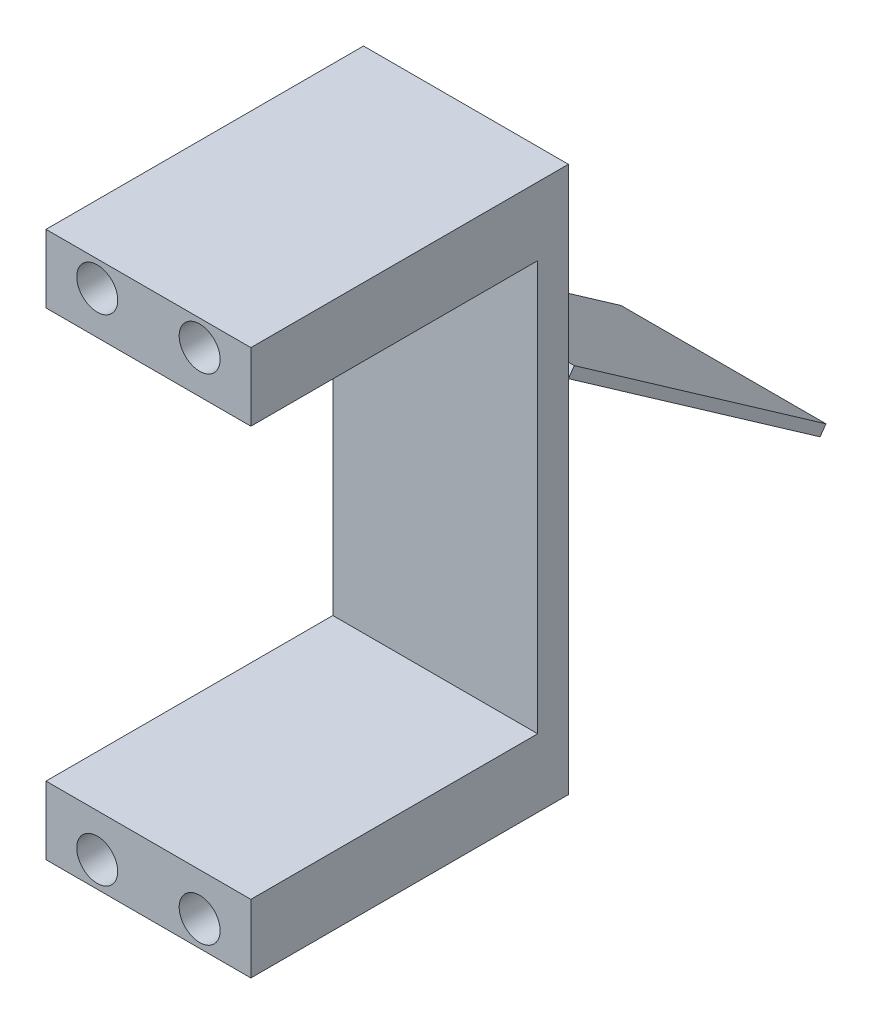
ISO-10303-21;
HEADER;
FILE_DESCRIPTION(('STEP AP214'),'2;1');
FILE_NAME('part.step','',(''),(''),'','','');
FILE_SCHEMA(('AUTOMOTIVE_DESIGN { 1 0 10303 214 1 1 1 1 }'));
ENDSEC;
DATA;
#1=APPLICATION_CONTEXT('core data for automotive mechanical design processes');
#2=APPLICATION_PROTOCOL_DEFINITION('international standard','automotive_design',2000,#1);
#3=PRODUCT_CONTEXT('',#1,'mechanical');
#4=PRODUCT('Part','Part','',(#3));
#5=PRODUCT_RELATED_PRODUCT_CATEGORY('part','',(#4));
#6=PRODUCT_DEFINITION_FORMATION('','',#4);
#7=PRODUCT_DEFINITION_CONTEXT('part definition',#1,'design');
#8=PRODUCT_DEFINITION('design','',#6,#7);
#9=PRODUCT_DEFINITION_SHAPE('','',#8);
#10=(LENGTH_UNIT() NAMED_UNIT(*) SI_UNIT(.MILLI.,.METRE.));
#11=(NAMED_UNIT(*) PLANE_ANGLE_UNIT() SI_UNIT($,.RADIAN.));
#12=(NAMED_UNIT(*) SI_UNIT($,.STERADIAN.) SOLID_ANGLE_UNIT());
#13=UNCERTAINTY_MEASURE_WITH_UNIT(LENGTH_MEASURE(1.E-05),#10,'distance_accuracy_value','');
#14=(GEOMETRIC_REPRESENTATION_CONTEXT(3) GLOBAL_UNCERTAINTY_ASSIGNED_CONTEXT((#13)) GLOBAL_UNIT_ASSIGNED_CONTEXT((#10,
#11,#12)) REPRESENTATION_CONTEXT('',''));
#15=CARTESIAN_POINT('',(0.,0.,0.));
#16=DIRECTION('',(0.,0.,1.));
#17=DIRECTION('',(1.,0.,0.));
#18=AXIS2_PLACEMENT_3D('',#15,#16,#17);
#19=CARTESIAN_POINT('',(-17.265593175589,35.819152044289,-0.573576436351047));
#20=DIRECTION('',(1.,0.,0.));
#21=DIRECTION('',(0.,0.,-1.));
#22=AXIS2_PLACEMENT_3D('',#19,#20,#21);
#23=PLANE('',#22);
#24=DIRECTION('',(0.,0.573576436351047,0.819152044288991));
#25=VECTOR('',#24,1.);
#26=CARTESIAN_POINT('',(-17.265593175589,35.,0.));
#27=LINE('',#26,#25);
#28=CARTESIAN_POINT('',(-17.265593175589,17.7927069094686,-24.5745613286697));
#29=VERTEX_POINT('',#28);
#30=CARTESIAN_POINT('',(-17.265593175589,35.,0.));
#31=VERTEX_POINT('',#30);
#32=EDGE_CURVE('E118',#29,#31,#27,.T.);
#33=ORIENTED_EDGE('',*,*,#32,.T.);
#34=DIRECTION('',(0.,-0.819152044288991,0.573576436351047));
#35=VECTOR('',#34,1.);
#36=CARTESIAN_POINT('',(-17.265593175589,35.819152044289,-0.573576436351047));
#37=LINE('',#36,#35);
#38=CARTESIAN_POINT('',(-17.265593175589,35.819152044289,-0.573576436351047));
#39=VERTEX_POINT('',#38);
#40=EDGE_CURVE('E12',#39,#31,#37,.T.);
#41=ORIENTED_EDGE('',*,*,#40,.F.);
#42=DIRECTION('',(0.,0.573576436351047,0.819152044288991));
#43=VECTOR('',#42,1.);
#44=CARTESIAN_POINT('',(-17.265593175589,35.819152044289,-0.573576436351047));
#45=LINE('',#44,#43);
#46=CARTESIAN_POINT('',(-17.265593175589,18.6118589537576,-25.1481377650208));
#47=VERTEX_POINT('',#46);
#48=EDGE_CURVE('E106',#47,#39,#45,.T.);
#49=ORIENTED_EDGE('',*,*,#48,.F.);
#50=DIRECTION('',(0.,-0.819152044288991,0.573576436351047));
#51=VECTOR('',#50,1.);
#52=CARTESIAN_POINT('',(-17.265593175589,18.6118589537576,-25.1481377650208));
#53=LINE('',#52,#51);
#54=EDGE_CURVE('E114',#47,#29,#53,.T.);
#55=ORIENTED_EDGE('',*,*,#54,.T.);
#56=EDGE_LOOP('',(#33,#41,#49,#55));
#57=FACE_BOUND('',#56,.T.);
#58=ADVANCED_FACE('F55',(#57),#23,.F.);
#59=CARTESIAN_POINT('',(-17.265593175589,35.819152044289,-0.573576436351047));
#60=DIRECTION('',(0.,-0.573576436351047,-0.819152044288991));
#61=DIRECTION('',(0.,0.819152044288991,-0.573576436351047));
#62=AXIS2_PLACEMENT_3D('',#59,#60,#61);
#63=PLANE('',#62);
#64=DIRECTION('',(1.,0.,0.));
#65=VECTOR('',#64,1.);
#66=CARTESIAN_POINT('',(-17.265593175589,35.,0.));
#67=LINE('',#66,#65);
#68=CARTESIAN_POINT('',(2.73440682441098,35.,0.));
#69=VERTEX_POINT('',#68);
#70=EDGE_CURVE('E110',#31,#69,#67,.T.);
#71=ORIENTED_EDGE('',*,*,#70,.T.);
#72=DIRECTION('',(0.,-0.819152044288991,0.573576436351047));
#73=VECTOR('',#72,1.);
#74=CARTESIAN_POINT('',(2.73440682441098,35.819152044289,-0.573576436351047));
#75=LINE('',#74,#73);
#76=CARTESIAN_POINT('',(2.73440682441098,35.819152044289,-0.573576436351047));
#77=VERTEX_POINT('',#76);
#78=EDGE_CURVE('E63',#77,#69,#75,.T.);
#79=ORIENTED_EDGE('',*,*,#78,.F.);
#80=DIRECTION('',(1.,0.,0.));
#81=VECTOR('',#80,1.);
#82=CARTESIAN_POINT('',(-17.265593175589,35.819152044289,-0.573576436351047));
#83=LINE('',#82,#81);
#84=EDGE_CURVE('E101',#39,#77,#83,.T.);
#85=ORIENTED_EDGE('',*,*,#84,.F.);
#86=ORIENTED_EDGE('',*,*,#40,.T.);
#87=EDGE_LOOP('',(#71,#79,#85,#86));
#88=FACE_BOUND('',#87,.T.);
#89=ADVANCED_FACE('F109',(#88),#63,.F.);
#90=CARTESIAN_POINT('',(2.73440682441098,35.819152044289,-0.573576436351047));
#91=DIRECTION('',(-1.,0.,0.));
#92=DIRECTION('',(0.,0.,1.));
#93=AXIS2_PLACEMENT_3D('',#90,#91,#92);
#94=PLANE('',#93);
#95=DIRECTION('',(0.,-0.573576436351047,-0.819152044288991));
#96=VECTOR('',#95,1.);
#97=CARTESIAN_POINT('',(2.73440682441098,35.,0.));
#98=LINE('',#97,#96);
#99=CARTESIAN_POINT('',(2.73440682441098,17.7927069094686,-24.5745613286697));
#100=VERTEX_POINT('',#99);
#101=EDGE_CURVE('E88',#69,#100,#98,.T.);
#102=ORIENTED_EDGE('',*,*,#101,.T.);
#103=DIRECTION('',(0.,-0.819152044288991,0.573576436351047));
#104=VECTOR('',#103,1.);
#105=CARTESIAN_POINT('',(2.73440682441098,18.6118589537576,-25.1481377650208));
#106=LINE('',#105,#104);
#107=CARTESIAN_POINT('',(2.73440682441098,18.6118589537576,-25.1481377650208));
#108=VERTEX_POINT('',#107);
#109=EDGE_CURVE('E111',#108,#100,#106,.T.);
#110=ORIENTED_EDGE('',*,*,#109,.F.);
#111=DIRECTION('',(0.,-0.573576436351047,-0.819152044288991));
#112=VECTOR('',#111,1.);
#113=CARTESIAN_POINT('',(2.73440682441098,35.819152044289,-0.573576436351047));
#114=LINE('',#113,#112);
#115=EDGE_CURVE('E104',#77,#108,#114,.T.);
#116=ORIENTED_EDGE('',*,*,#115,.F.);
#117=ORIENTED_EDGE('',*,*,#78,.T.);
#118=EDGE_LOOP('',(#102,#110,#116,#117));
#119=FACE_BOUND('',#118,.T.);
#120=ADVANCED_FACE('F112',(#119),#94,.F.);
#121=CARTESIAN_POINT('',(-17.265593175589,18.6118589537576,-25.1481377650208));
#122=DIRECTION('',(0.,0.573576436351047,0.819152044288991));
#123=DIRECTION('',(0.,-0.819152044288991,0.573576436351047));
#124=AXIS2_PLACEMENT_3D('',#121,#122,#123);
#125=PLANE('',#124);
#126=DIRECTION('',(-1.,0.,0.));
#127=VECTOR('',#126,1.);
#128=CARTESIAN_POINT('',(-17.265593175589,17.7927069094686,-24.5745613286697));
#129=LINE('',#128,#127);
#130=EDGE_CURVE('E94',#100,#29,#129,.T.);
#131=ORIENTED_EDGE('',*,*,#130,.T.);
#132=ORIENTED_EDGE('',*,*,#54,.F.);
#133=DIRECTION('',(-1.,0.,0.));
#134=VECTOR('',#133,1.);
#135=CARTESIAN_POINT('',(-17.265593175589,18.6118589537576,-25.1481377650208));
#136=LINE('',#135,#134);
#137=EDGE_CURVE('E71',#108,#47,#136,.T.);
#138=ORIENTED_EDGE('',*,*,#137,.F.);
#139=ORIENTED_EDGE('',*,*,#109,.T.);
#140=EDGE_LOOP('',(#131,#132,#138,#139));
#141=FACE_BOUND('',#140,.T.);
#142=ADVANCED_FACE('F125',(#141),#125,.F.);
#143=CARTESIAN_POINT('',(0.,24.3045045524882,-17.0181973001045));
#144=DIRECTION('',(0.,-0.819152044288991,0.573576436351047));
#145=DIRECTION('',(0.,-0.573576436351047,-0.819152044288991));
#146=AXIS2_PLACEMENT_3D('',#143,#144,#145);
#147=PLANE('',#146);
#148=ORIENTED_EDGE('',*,*,#48,.T.);
#149=ORIENTED_EDGE('',*,*,#84,.T.);
#150=ORIENTED_EDGE('',*,*,#115,.T.);
#151=ORIENTED_EDGE('',*,*,#137,.T.);
#152=EDGE_LOOP('',(#148,#149,#150,#151));
#153=FACE_BOUND('',#152,.T.);
#154=ADVANCED_FACE('F102',(#153),#147,.F.);
#155=CARTESIAN_POINT('',(0.,23.4853525081992,-16.4446208637534));
#156=DIRECTION('',(0.,-0.819152044288991,0.573576436351047));
#157=DIRECTION('',(0.,-0.573576436351047,-0.819152044288991));
#158=AXIS2_PLACEMENT_3D('',#155,#156,#157);
#159=PLANE('',#158);
#160=ORIENTED_EDGE('',*,*,#32,.F.);
#161=ORIENTED_EDGE('',*,*,#130,.F.);
#162=ORIENTED_EDGE('',*,*,#101,.F.);
#163=ORIENTED_EDGE('',*,*,#70,.F.);
#164=EDGE_LOOP('',(#160,#161,#162,#163));
#165=FACE_BOUND('',#164,.T.);
#166=ADVANCED_FACE('F128',(#165),#159,.T.);
#167=CLOSED_SHELL('',(#58,#89,#120,#142,#154,#166));
#168=MANIFOLD_SOLID_BREP('B2',#167);
#169=CARTESIAN_POINT('',(-17.265593175589,1.2474912978341E-13,3.));
#170=DIRECTION('',(-1.,0.,0.));
#171=DIRECTION('',(0.,-1.,0.));
#172=AXIS2_PLACEMENT_3D('',#169,#170,#171);
#173=PLANE('',#172);
#174=DIRECTION('',(0.,1.,0.));
#175=VECTOR('',#174,1.);
#176=CARTESIAN_POINT('',(-17.265593175589,1.2474912978341E-13,0.));
#177=LINE('',#176,#175);
#178=CARTESIAN_POINT('',(-17.265593175589,-0.1716647793334,0.));
#179=VERTEX_POINT('',#178);
#180=CARTESIAN_POINT('',(-17.2655931755886,53.1283352206666,0.));
#181=VERTEX_POINT('',#180);
#182=EDGE_CURVE('E248',#179,#181,#177,.T.);
#183=ORIENTED_EDGE('',*,*,#182,.F.);
#184=DIRECTION('',(0.,0.,-1.));
#185=VECTOR('',#184,1.);
#186=CARTESIAN_POINT('',(-17.265593175589,-0.1716647793334,31.));
#187=LINE('',#186,#185);
#188=CARTESIAN_POINT('',(-17.265593175589,-0.1716647793334,31.));
#189=VERTEX_POINT('',#188);
#190=EDGE_CURVE('E306',#189,#179,#187,.T.);
#191=ORIENTED_EDGE('',*,*,#190,.F.);
#192=DIRECTION('',(0.,1.,0.));
#193=VECTOR('',#192,1.);
#194=CARTESIAN_POINT('',(-17.265593175589,1.2474912978341E-13,31.));
#195=LINE('',#194,#193);
#196=CARTESIAN_POINT('',(-17.265593175589,6.47833522066659,31.));
#197=VERTEX_POINT('',#196);
#198=EDGE_CURVE('E300',#189,#197,#195,.T.);
#199=ORIENTED_EDGE('',*,*,#198,.T.);
#200=DIRECTION('',(0.,0.,-1.));
#201=VECTOR('',#200,1.);
#202=CARTESIAN_POINT('',(-17.265593175589,6.47833522066659,31.));
#203=LINE('',#202,#201);
#204=CARTESIAN_POINT('',(-17.265593175589,6.47833522066659,3.));
#205=VERTEX_POINT('',#204);
#206=EDGE_CURVE('E317',#197,#205,#203,.T.);
#207=ORIENTED_EDGE('',*,*,#206,.T.);
#208=DIRECTION('',(0.,1.,0.));
#209=VECTOR('',#208,1.);
#210=CARTESIAN_POINT('',(-17.265593175589,1.2474912978341E-13,3.));
#211=LINE('',#210,#209);
#212=CARTESIAN_POINT('',(-17.2655931755887,46.4783352206666,3.));
#213=VERTEX_POINT('',#212);
#214=EDGE_CURVE('E325',#205,#213,#211,.T.);
#215=ORIENTED_EDGE('',*,*,#214,.T.);
#216=DIRECTION('',(0.,0.,-1.));
#217=VECTOR('',#216,1.);
#218=CARTESIAN_POINT('',(-17.2655931755887,46.4783352206666,31.));
#219=LINE('',#218,#217);
#220=CARTESIAN_POINT('',(-17.2655931755887,46.4783352206666,31.));
#221=VERTEX_POINT('',#220);
#222=EDGE_CURVE('E195',#221,#213,#219,.T.);
#223=ORIENTED_EDGE('',*,*,#222,.F.);
#224=DIRECTION('',(0.,1.,0.));
#225=VECTOR('',#224,1.);
#226=CARTESIAN_POINT('',(-17.265593175589,1.2474912978341E-13,31.));
#227=LINE('',#226,#225);
#228=CARTESIAN_POINT('',(-17.2655931755886,53.1283352206666,31.));
#229=VERTEX_POINT('',#228);
#230=EDGE_CURVE('E262',#221,#229,#227,.T.);
#231=ORIENTED_EDGE('',*,*,#230,.T.);
#232=DIRECTION('',(0.,0.,-1.));
#233=VECTOR('',#232,1.);
#234=CARTESIAN_POINT('',(-17.2655931755886,53.1283352206666,31.));
#235=LINE('',#234,#233);
#236=EDGE_CURVE('E284',#229,#181,#235,.T.);
#237=ORIENTED_EDGE('',*,*,#236,.T.);
#238=EDGE_LOOP('',(#183,#191,#199,#207,#215,#223,#231,#237));
#239=FACE_BOUND('',#238,.T.);
#240=ADVANCED_FACE('F179',(#239),#173,.T.);
#241=CARTESIAN_POINT('',(2.73440682441098,0.,3.));
#242=DIRECTION('',(-1.,0.,0.));
#243=DIRECTION('',(0.,-1.,0.));
#244=AXIS2_PLACEMENT_3D('',#241,#242,#243);
#245=PLANE('',#244);
#246=DIRECTION('',(0.,1.,0.));
#247=VECTOR('',#246,1.);
#248=CARTESIAN_POINT('',(2.73440682441098,0.,0.));
#249=LINE('',#248,#247);
#250=CARTESIAN_POINT('',(2.73440682441098,-0.171664779333407,0.));
#251=VERTEX_POINT('',#250);
#252=CARTESIAN_POINT('',(2.73440682441064,53.1283352206666,0.));
#253=VERTEX_POINT('',#252);
#254=EDGE_CURVE('E182',#251,#253,#249,.T.);
#255=ORIENTED_EDGE('',*,*,#254,.T.);
#256=DIRECTION('',(0.,0.,-1.));
#257=VECTOR('',#256,1.);
#258=CARTESIAN_POINT('',(2.73440682441064,53.1283352206666,31.));
#259=LINE('',#258,#257);
#260=CARTESIAN_POINT('',(2.73440682441064,53.1283352206666,31.));
#261=VERTEX_POINT('',#260);
#262=EDGE_CURVE('E249',#261,#253,#259,.T.);
#263=ORIENTED_EDGE('',*,*,#262,.F.);
#264=DIRECTION('',(0.,1.,0.));
#265=VECTOR('',#264,1.);
#266=CARTESIAN_POINT('',(2.73440682441098,0.,31.));
#267=LINE('',#266,#265);
#268=CARTESIAN_POINT('',(2.73440682441095,46.4783352206666,31.));
#269=VERTEX_POINT('',#268);
#270=EDGE_CURVE('E253',#269,#261,#267,.T.);
#271=ORIENTED_EDGE('',*,*,#270,.F.);
#272=DIRECTION('',(0.,0.,-1.));
#273=VECTOR('',#272,1.);
#274=CARTESIAN_POINT('',(2.73440682441095,46.4783352206666,31.));
#275=LINE('',#274,#273);
#276=CARTESIAN_POINT('',(2.73440682441095,46.4783352206666,3.));
#277=VERTEX_POINT('',#276);
#278=EDGE_CURVE('E242',#269,#277,#275,.T.);
#279=ORIENTED_EDGE('',*,*,#278,.T.);
#280=DIRECTION('',(0.,1.,0.));
#281=VECTOR('',#280,1.);
#282=CARTESIAN_POINT('',(2.73440682441098,0.,3.));
#283=LINE('',#282,#281);
#284=CARTESIAN_POINT('',(2.73440682441094,6.47833522066658,3.));
#285=VERTEX_POINT('',#284);
#286=EDGE_CURVE('E187',#285,#277,#283,.T.);
#287=ORIENTED_EDGE('',*,*,#286,.F.);
#288=DIRECTION('',(0.,0.,-1.));
#289=VECTOR('',#288,1.);
#290=CARTESIAN_POINT('',(2.73440682441094,6.47833522066658,31.));
#291=LINE('',#290,#289);
#292=CARTESIAN_POINT('',(2.73440682441094,6.47833522066658,31.));
#293=VERTEX_POINT('',#292);
#294=EDGE_CURVE('E320',#293,#285,#291,.T.);
#295=ORIENTED_EDGE('',*,*,#294,.F.);
#296=DIRECTION('',(0.,1.,0.));
#297=VECTOR('',#296,1.);
#298=CARTESIAN_POINT('',(2.73440682441098,0.,31.));
#299=LINE('',#298,#297);
#300=CARTESIAN_POINT('',(2.73440682441098,-0.171664779333407,31.));
#301=VERTEX_POINT('',#300);
#302=EDGE_CURVE('E295',#301,#293,#299,.T.);
#303=ORIENTED_EDGE('',*,*,#302,.F.);
#304=DIRECTION('',(0.,0.,-1.));
#305=VECTOR('',#304,1.);
#306=CARTESIAN_POINT('',(2.73440682441098,-0.171664779333407,31.));
#307=LINE('',#306,#305);
#308=EDGE_CURVE('E278',#301,#251,#307,.T.);
#309=ORIENTED_EDGE('',*,*,#308,.T.);
#310=EDGE_LOOP('',(#255,#263,#271,#279,#287,#295,#303,#309));
#311=FACE_BOUND('',#310,.T.);
#312=ADVANCED_FACE('F254',(#311),#245,.F.);
#313=CARTESIAN_POINT('',(0.,0.,3.));
#314=DIRECTION('',(0.,0.,1.));
#315=DIRECTION('',(1.,0.,0.));
#316=AXIS2_PLACEMENT_3D('',#313,#314,#315);
#317=PLANE('',#316);
#318=ORIENTED_EDGE('',*,*,#214,.F.);
#319=DIRECTION('',(-1.,0.,0.));
#320=VECTOR('',#319,1.);
#321=CARTESIAN_POINT('',(0.,6.47833522066659,3.));
#322=LINE('',#321,#320);
#323=EDGE_CURVE('E328',#285,#205,#322,.T.);
#324=ORIENTED_EDGE('',*,*,#323,.F.);
#325=ORIENTED_EDGE('',*,*,#286,.T.);
#326=DIRECTION('',(-1.,0.,0.));
#327=VECTOR('',#326,1.);
#328=CARTESIAN_POINT('',(0.,46.4783352206666,3.));
#329=LINE('',#328,#327);
#330=EDGE_CURVE('E53',#277,#213,#329,.T.);
#331=ORIENTED_EDGE('',*,*,#330,.T.);
#332=EDGE_LOOP('',(#318,#324,#325,#331));
#333=FACE_BOUND('',#332,.T.);
#334=ADVANCED_FACE('F343',(#333),#317,.T.);
#335=CARTESIAN_POINT('',(0.,0.,0.));
#336=DIRECTION('',(0.,0.,1.));
#337=DIRECTION('',(1.,0.,0.));
#338=AXIS2_PLACEMENT_3D('',#335,#336,#337);
#339=PLANE('',#338);
#340=ORIENTED_EDGE('',*,*,#182,.T.);
#341=DIRECTION('',(-1.,0.,0.));
#342=VECTOR('',#341,1.);
#343=CARTESIAN_POINT('',(0.,53.1283352206666,0.));
#344=LINE('',#343,#342);
#345=EDGE_CURVE('E277',#253,#181,#344,.T.);
#346=ORIENTED_EDGE('',*,*,#345,.F.);
#347=ORIENTED_EDGE('',*,*,#254,.F.);
#348=DIRECTION('',(-1.,0.,0.));
#349=VECTOR('',#348,1.);
#350=CARTESIAN_POINT('',(0.,-0.171664779333406,0.));
#351=LINE('',#350,#349);
#352=EDGE_CURVE('E310',#251,#179,#351,.T.);
#353=ORIENTED_EDGE('',*,*,#352,.T.);
#354=EDGE_LOOP('',(#340,#346,#347,#353));
#355=FACE_BOUND('',#354,.T.);
#356=CARTESIAN_POINT('',(-12.265593175589,50.6283352206666,0.));
#357=DIRECTION('',(0.,0.,1.));
#358=DIRECTION('',(1.,0.,0.));
#359=AXIS2_PLACEMENT_3D('',#356,#357,#358);
#360=CIRCLE('',#359,2.00000000000001);
#361=CARTESIAN_POINT('',(-10.265593175589,50.6283352206666,0.));
#362=VERTEX_POINT('',#361);
#363=EDGE_CURVE('E274',#362,#362,#360,.T.);
#364=ORIENTED_EDGE('',*,*,#363,.T.);
#365=EDGE_LOOP('',(#364));
#366=FACE_BOUND('',#365,.T.);
#367=CARTESIAN_POINT('',(-2.26559317558901,50.6283352206666,0.));
#368=DIRECTION('',(0.,0.,1.));
#369=DIRECTION('',(1.,0.,0.));
#370=AXIS2_PLACEMENT_3D('',#367,#368,#369);
#371=CIRCLE('',#370,2.00000000000001);
#372=CARTESIAN_POINT('',(-0.265593175589001,50.6283352206666,0.));
#373=VERTEX_POINT('',#372);
#374=EDGE_CURVE('E266',#373,#373,#371,.F.);
#375=ORIENTED_EDGE('',*,*,#374,.F.);
#376=EDGE_LOOP('',(#375));
#377=FACE_BOUND('',#376,.T.);
#378=CARTESIAN_POINT('',(-2.265593175589,2.32833522066659,0.));
#379=DIRECTION('',(0.,0.,1.));
#380=DIRECTION('',(1.,0.,0.));
#381=AXIS2_PLACEMENT_3D('',#378,#379,#380);
#382=CIRCLE('',#381,1.99999999999999);
#383=CARTESIAN_POINT('',(-0.265593175589011,2.32833522066659,0.));
#384=VERTEX_POINT('',#383);
#385=EDGE_CURVE('E307',#384,#384,#382,.T.);
#386=ORIENTED_EDGE('',*,*,#385,.T.);
#387=EDGE_LOOP('',(#386));
#388=FACE_BOUND('',#387,.T.);
#389=CARTESIAN_POINT('',(-12.265593175589,2.32833522066659,0.));
#390=DIRECTION('',(0.,0.,1.));
#391=DIRECTION('',(1.,0.,0.));
#392=AXIS2_PLACEMENT_3D('',#389,#390,#391);
#393=CIRCLE('',#392,2.00000000000001);
#394=CARTESIAN_POINT('',(-10.265593175589,2.32833522066659,0.));
#395=VERTEX_POINT('',#394);
#396=EDGE_CURVE('E292',#395,#395,#393,.F.);
#397=ORIENTED_EDGE('',*,*,#396,.F.);
#398=EDGE_LOOP('',(#397));
#399=FACE_BOUND('',#398,.T.);
#400=ADVANCED_FACE('F335',(#355,#366,#377,#388,#399),#339,.F.);
#401=CARTESIAN_POINT('',(0.,46.4783352206666,31.));
#402=DIRECTION('',(0.,-1.,0.));
#403=DIRECTION('',(1.,0.,0.));
#404=AXIS2_PLACEMENT_3D('',#401,#402,#403);
#405=PLANE('',#404);
#406=ORIENTED_EDGE('',*,*,#330,.F.);
#407=ORIENTED_EDGE('',*,*,#278,.F.);
#408=DIRECTION('',(-1.,0.,0.));
#409=VECTOR('',#408,1.);
#410=CARTESIAN_POINT('',(0.,46.4783352206666,31.));
#411=LINE('',#410,#409);
#412=EDGE_CURVE('E246',#269,#221,#411,.T.);
#413=ORIENTED_EDGE('',*,*,#412,.T.);
#414=ORIENTED_EDGE('',*,*,#222,.T.);
#415=EDGE_LOOP('',(#406,#407,#413,#414));
#416=FACE_BOUND('',#415,.T.);
#417=ADVANCED_FACE('F244',(#416),#405,.T.);
#418=CARTESIAN_POINT('',(0.,53.1283352206666,31.));
#419=DIRECTION('',(0.,-1.,0.));
#420=DIRECTION('',(1.,0.,0.));
#421=AXIS2_PLACEMENT_3D('',#418,#419,#420);
#422=PLANE('',#421);
#423=ORIENTED_EDGE('',*,*,#345,.T.);
#424=ORIENTED_EDGE('',*,*,#236,.F.);
#425=DIRECTION('',(-1.,0.,0.));
#426=VECTOR('',#425,1.);
#427=CARTESIAN_POINT('',(0.,53.1283352206666,31.));
#428=LINE('',#427,#426);
#429=EDGE_CURVE('E257',#261,#229,#428,.T.);
#430=ORIENTED_EDGE('',*,*,#429,.F.);
#431=ORIENTED_EDGE('',*,*,#262,.T.);
#432=EDGE_LOOP('',(#423,#424,#430,#431));
#433=FACE_BOUND('',#432,.T.);
#434=ADVANCED_FACE('F339',(#433),#422,.F.);
#435=CARTESIAN_POINT('',(-12.265593175589,50.6283352206666,31.));
#436=DIRECTION('',(0.,0.,-1.));
#437=DIRECTION('',(-1.,0.,0.));
#438=AXIS2_PLACEMENT_3D('',#435,#436,#437);
#439=CYLINDRICAL_SURFACE('',#438,2.00000000000001);
#440=CARTESIAN_POINT('',(-12.265593175589,50.6283352206666,31.));
#441=DIRECTION('',(0.,0.,1.));
#442=DIRECTION('',(1.,0.,0.));
#443=AXIS2_PLACEMENT_3D('',#440,#441,#442);
#444=CIRCLE('',#443,2.00000000000001);
#445=CARTESIAN_POINT('',(-10.265593175589,50.6283352206666,31.));
#446=VERTEX_POINT('',#445);
#447=EDGE_CURVE('E263',#446,#446,#444,.T.);
#448=ORIENTED_EDGE('',*,*,#447,.T.);
#449=EDGE_LOOP('',(#448));
#450=FACE_BOUND('',#449,.T.);
#451=ORIENTED_EDGE('',*,*,#363,.F.);
#452=EDGE_LOOP('',(#451));
#453=FACE_BOUND('',#452,.T.);
#454=ADVANCED_FACE('F381',(#450,#453),#439,.F.);
#455=CARTESIAN_POINT('',(-2.26559317558901,50.6283352206666,31.));
#456=DIRECTION('',(0.,0.,-1.));
#457=DIRECTION('',(-1.,0.,0.));
#458=AXIS2_PLACEMENT_3D('',#455,#456,#457);
#459=CYLINDRICAL_SURFACE('',#458,2.00000000000001);
#460=CARTESIAN_POINT('',(-2.26559317558901,50.6283352206666,31.));
#461=DIRECTION('',(0.,0.,1.));
#462=DIRECTION('',(1.,0.,0.));
#463=AXIS2_PLACEMENT_3D('',#460,#461,#462);
#464=CIRCLE('',#463,2.00000000000001);
#465=CARTESIAN_POINT('',(-0.265593175589001,50.6283352206666,31.));
#466=VERTEX_POINT('',#465);
#467=EDGE_CURVE('E271',#466,#466,#464,.F.);
#468=ORIENTED_EDGE('',*,*,#467,.F.);
#469=EDGE_LOOP('',(#468));
#470=FACE_BOUND('',#469,.T.);
#471=ORIENTED_EDGE('',*,*,#374,.T.);
#472=EDGE_LOOP('',(#471));
#473=FACE_BOUND('',#472,.T.);
#474=ADVANCED_FACE('F387',(#470,#473),#459,.F.);
#475=CARTESIAN_POINT('',(0.,0.,31.));
#476=DIRECTION('',(0.,0.,1.));
#477=DIRECTION('',(1.,0.,0.));
#478=AXIS2_PLACEMENT_3D('',#475,#476,#477);
#479=PLANE('',#478);
#480=ORIENTED_EDGE('',*,*,#447,.F.);
#481=EDGE_LOOP('',(#480));
#482=FACE_BOUND('',#481,.T.);
#483=ORIENTED_EDGE('',*,*,#412,.F.);
#484=ORIENTED_EDGE('',*,*,#270,.T.);
#485=ORIENTED_EDGE('',*,*,#429,.T.);
#486=ORIENTED_EDGE('',*,*,#230,.F.);
#487=EDGE_LOOP('',(#483,#484,#485,#486));
#488=FACE_BOUND('',#487,.T.);
#489=ORIENTED_EDGE('',*,*,#467,.T.);
#490=EDGE_LOOP('',(#489));
#491=FACE_BOUND('',#490,.T.);
#492=ADVANCED_FACE('F259',(#482,#488,#491),#479,.T.);
#493=CARTESIAN_POINT('',(0.,6.47833522066659,31.));
#494=DIRECTION('',(0.,-1.,0.));
#495=DIRECTION('',(1.,0.,0.));
#496=AXIS2_PLACEMENT_3D('',#493,#494,#495);
#497=PLANE('',#496);
#498=ORIENTED_EDGE('',*,*,#294,.T.);
#499=ORIENTED_EDGE('',*,*,#323,.T.);
#500=ORIENTED_EDGE('',*,*,#206,.F.);
#501=DIRECTION('',(-1.,0.,0.));
#502=VECTOR('',#501,1.);
#503=CARTESIAN_POINT('',(0.,6.47833522066659,31.));
#504=LINE('',#503,#502);
#505=EDGE_CURVE('E298',#293,#197,#504,.T.);
#506=ORIENTED_EDGE('',*,*,#505,.F.);
#507=EDGE_LOOP('',(#498,#499,#500,#506));
#508=FACE_BOUND('',#507,.T.);
#509=ADVANCED_FACE('F345',(#508),#497,.F.);
#510=CARTESIAN_POINT('',(0.,-0.171664779333406,31.));
#511=DIRECTION('',(0.,-1.,0.));
#512=DIRECTION('',(1.,0.,0.));
#513=AXIS2_PLACEMENT_3D('',#510,#511,#512);
#514=PLANE('',#513);
#515=ORIENTED_EDGE('',*,*,#352,.F.);
#516=ORIENTED_EDGE('',*,*,#308,.F.);
#517=DIRECTION('',(-1.,0.,0.));
#518=VECTOR('',#517,1.);
#519=CARTESIAN_POINT('',(0.,-0.171664779333406,31.));
#520=LINE('',#519,#518);
#521=EDGE_CURVE('E291',#301,#189,#520,.T.);
#522=ORIENTED_EDGE('',*,*,#521,.T.);
#523=ORIENTED_EDGE('',*,*,#190,.T.);
#524=EDGE_LOOP('',(#515,#516,#522,#523));
#525=FACE_BOUND('',#524,.T.);
#526=ADVANCED_FACE('F352',(#525),#514,.T.);
#527=CARTESIAN_POINT('',(-2.265593175589,2.32833522066659,31.));
#528=DIRECTION('',(0.,0.,-1.));
#529=DIRECTION('',(-1.,0.,0.));
#530=AXIS2_PLACEMENT_3D('',#527,#528,#529);
#531=CYLINDRICAL_SURFACE('',#530,1.99999999999999);
#532=CARTESIAN_POINT('',(-2.265593175589,2.32833522066659,31.));
#533=DIRECTION('',(0.,0.,1.));
#534=DIRECTION('',(1.,0.,0.));
#535=AXIS2_PLACEMENT_3D('',#532,#533,#534);
#536=CIRCLE('',#535,1.99999999999999);
#537=CARTESIAN_POINT('',(-0.265593175589011,2.32833522066659,31.));
#538=VERTEX_POINT('',#537);
#539=EDGE_CURVE('E288',#538,#538,#536,.T.);
#540=ORIENTED_EDGE('',*,*,#539,.T.);
#541=EDGE_LOOP('',(#540));
#542=FACE_BOUND('',#541,.T.);
#543=ORIENTED_EDGE('',*,*,#385,.F.);
#544=EDGE_LOOP('',(#543));
#545=FACE_BOUND('',#544,.T.);
#546=ADVANCED_FACE('F354',(#542,#545),#531,.F.);
#547=CARTESIAN_POINT('',(-12.265593175589,2.32833522066659,31.));
#548=DIRECTION('',(0.,0.,-1.));
#549=DIRECTION('',(-1.,0.,0.));
#550=AXIS2_PLACEMENT_3D('',#547,#548,#549);
#551=CYLINDRICAL_SURFACE('',#550,2.00000000000001);
#552=CARTESIAN_POINT('',(-12.265593175589,2.32833522066659,31.));
#553=DIRECTION('',(0.,0.,1.));
#554=DIRECTION('',(1.,0.,0.));
#555=AXIS2_PLACEMENT_3D('',#552,#553,#554);
#556=CIRCLE('',#555,2.00000000000001);
#557=CARTESIAN_POINT('',(-10.265593175589,2.32833522066659,31.));
#558=VERTEX_POINT('',#557);
#559=EDGE_CURVE('E303',#558,#558,#556,.F.);
#560=ORIENTED_EDGE('',*,*,#559,.F.);
#561=EDGE_LOOP('',(#560));
#562=FACE_BOUND('',#561,.T.);
#563=ORIENTED_EDGE('',*,*,#396,.T.);
#564=EDGE_LOOP('',(#563));
#565=FACE_BOUND('',#564,.T.);
#566=ADVANCED_FACE('F360',(#562,#565),#551,.F.);
#567=CARTESIAN_POINT('',(0.,0.,31.));
#568=DIRECTION('',(0.,0.,1.));
#569=DIRECTION('',(1.,0.,0.));
#570=AXIS2_PLACEMENT_3D('',#567,#568,#569);
#571=PLANE('',#570);
#572=ORIENTED_EDGE('',*,*,#539,.F.);
#573=EDGE_LOOP('',(#572));
#574=FACE_BOUND('',#573,.T.);
#575=ORIENTED_EDGE('',*,*,#521,.F.);
#576=ORIENTED_EDGE('',*,*,#302,.T.);
#577=ORIENTED_EDGE('',*,*,#505,.T.);
#578=ORIENTED_EDGE('',*,*,#198,.F.);
#579=EDGE_LOOP('',(#575,#576,#577,#578));
#580=FACE_BOUND('',#579,.T.);
#581=ORIENTED_EDGE('',*,*,#559,.T.);
#582=EDGE_LOOP('',(#581));
#583=FACE_BOUND('',#582,.T.);
#584=ADVANCED_FACE('F349',(#574,#580,#583),#571,.T.);
#585=CLOSED_SHELL('',(#240,#312,#334,#400,#417,#434,#454,#474,#492,#509,#526,#546,#566,#584));
#586=MANIFOLD_SOLID_BREP('B6',#585);
#587=ADVANCED_BREP_SHAPE_REPRESENTATION('',(#18,#168,#586),#14);
#588=SHAPE_DEFINITION_REPRESENTATION(#9,#587);
ENDSEC;
END-ISO-10303-21;
